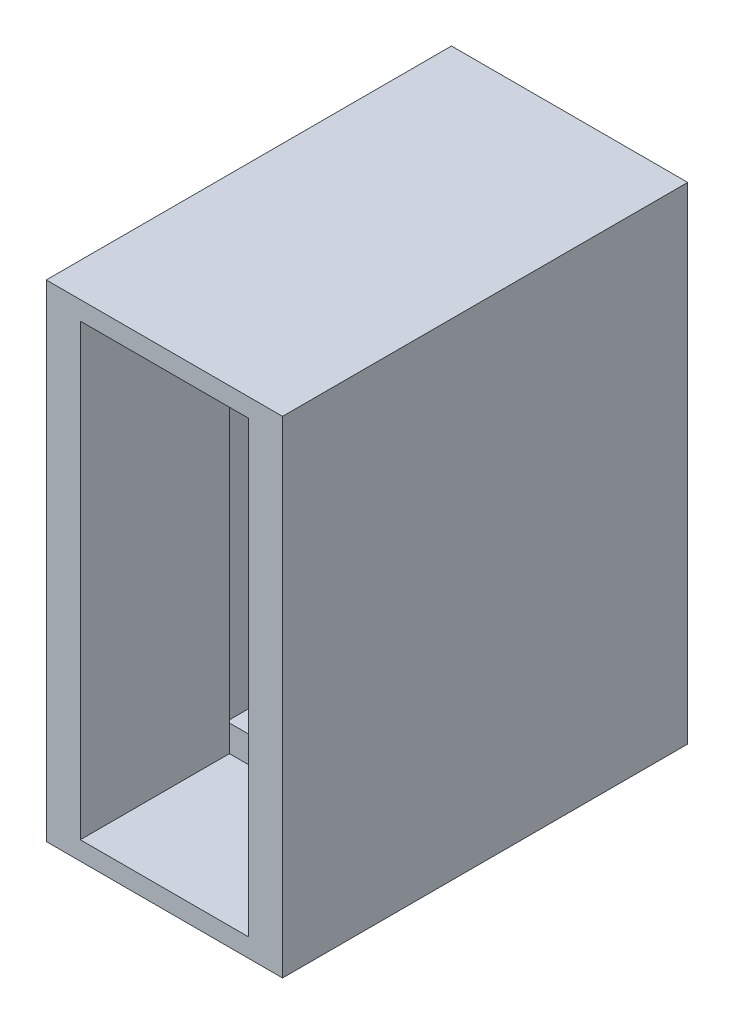
ISO-10303-21;
HEADER;
FILE_DESCRIPTION(('STEP AP214'),'2;1');
FILE_NAME('part.step','',(''),(''),'','','');
FILE_SCHEMA(('AUTOMOTIVE_DESIGN { 1 0 10303 214 1 1 1 1 }'));
ENDSEC;
DATA;
#1=APPLICATION_CONTEXT('core data for automotive mechanical design processes');
#2=APPLICATION_PROTOCOL_DEFINITION('international standard','automotive_design',2000,#1);
#3=PRODUCT_CONTEXT('',#1,'mechanical');
#4=PRODUCT('Part','Part','',(#3));
#5=PRODUCT_RELATED_PRODUCT_CATEGORY('part','',(#4));
#6=PRODUCT_DEFINITION_FORMATION('','',#4);
#7=PRODUCT_DEFINITION_CONTEXT('part definition',#1,'design');
#8=PRODUCT_DEFINITION('design','',#6,#7);
#9=PRODUCT_DEFINITION_SHAPE('','',#8);
#10=(LENGTH_UNIT() NAMED_UNIT(*) SI_UNIT(.MILLI.,.METRE.));
#11=(NAMED_UNIT(*) PLANE_ANGLE_UNIT() SI_UNIT($,.RADIAN.));
#12=(NAMED_UNIT(*) SI_UNIT($,.STERADIAN.) SOLID_ANGLE_UNIT());
#13=UNCERTAINTY_MEASURE_WITH_UNIT(LENGTH_MEASURE(1.E-05),#10,'distance_accuracy_value','');
#14=(GEOMETRIC_REPRESENTATION_CONTEXT(3) GLOBAL_UNCERTAINTY_ASSIGNED_CONTEXT((#13)) GLOBAL_UNIT_ASSIGNED_CONTEXT((#10,
#11,#12)) REPRESENTATION_CONTEXT('',''));
#15=CARTESIAN_POINT('',(0.,0.,0.));
#16=DIRECTION('',(0.,0.,1.));
#17=DIRECTION('',(1.,0.,0.));
#18=AXIS2_PLACEMENT_3D('',#15,#16,#17);
#19=CARTESIAN_POINT('',(0.,0.,29.27));
#20=DIRECTION('',(0.,0.,1.));
#21=DIRECTION('',(1.,0.,0.));
#22=AXIS2_PLACEMENT_3D('',#19,#20,#21);
#23=PLANE('',#22);
#24=DIRECTION('',(1.,0.,0.));
#25=VECTOR('',#24,1.);
#26=CARTESIAN_POINT('',(-2.24999999999999,3.25,29.27));
#27=LINE('',#26,#25);
#28=CARTESIAN_POINT('',(-14.55,3.25,29.27));
#29=VERTEX_POINT('',#28);
#30=CARTESIAN_POINT('',(-2.45,3.25,29.27));
#31=VERTEX_POINT('',#30);
#32=EDGE_CURVE('E11',#29,#31,#27,.T.);
#33=ORIENTED_EDGE('',*,*,#32,.F.);
#34=DIRECTION('',(0.,-1.,0.));
#35=VECTOR('',#34,1.);
#36=CARTESIAN_POINT('',(-14.55,1.34,29.27));
#37=LINE('',#36,#35);
#38=CARTESIAN_POINT('',(-14.55,1.34,29.27));
#39=VERTEX_POINT('',#38);
#40=EDGE_CURVE('E241',#29,#39,#37,.T.);
#41=ORIENTED_EDGE('',*,*,#40,.T.);
#42=DIRECTION('',(1.,0.,0.));
#43=VECTOR('',#42,1.);
#44=CARTESIAN_POINT('',(-2.45,1.34,29.27));
#45=LINE('',#44,#43);
#46=CARTESIAN_POINT('',(-2.45,1.34,29.27));
#47=VERTEX_POINT('',#46);
#48=EDGE_CURVE('E263',#39,#47,#45,.T.);
#49=ORIENTED_EDGE('',*,*,#48,.T.);
#50=DIRECTION('',(0.,1.,0.));
#51=VECTOR('',#50,1.);
#52=CARTESIAN_POINT('',(-2.45,1.34,29.27));
#53=LINE('',#52,#51);
#54=EDGE_CURVE('E257',#47,#31,#53,.T.);
#55=ORIENTED_EDGE('',*,*,#54,.T.);
#56=EDGE_LOOP('',(#33,#41,#49,#55));
#57=FACE_BOUND('',#56,.T.);
#58=ADVANCED_FACE('F44',(#57),#23,.T.);
#59=CARTESIAN_POINT('',(0.,0.,40.));
#60=DIRECTION('',(-1.,0.,0.));
#61=DIRECTION('',(0.,0.,1.));
#62=AXIS2_PLACEMENT_3D('',#59,#60,#61);
#63=PLANE('',#62);
#64=DIRECTION('',(0.,0.,-1.));
#65=VECTOR('',#64,1.);
#66=CARTESIAN_POINT('',(0.,0.,40.));
#67=LINE('',#66,#65);
#68=CARTESIAN_POINT('',(0.,0.,40.));
#69=VERTEX_POINT('',#68);
#70=CARTESIAN_POINT('',(0.,0.,10.843475328993));
#71=VERTEX_POINT('',#70);
#72=EDGE_CURVE('E189',#69,#71,#67,.T.);
#73=ORIENTED_EDGE('',*,*,#72,.T.);
#74=DIRECTION('',(0.,1.,0.));
#75=VECTOR('',#74,1.);
#76=CARTESIAN_POINT('',(0.,35.,10.843475328993));
#77=LINE('',#76,#75);
#78=CARTESIAN_POINT('',(0.,35.,10.843475328993));
#79=VERTEX_POINT('',#78);
#80=EDGE_CURVE('E64',#71,#79,#77,.T.);
#81=ORIENTED_EDGE('',*,*,#80,.T.);
#82=DIRECTION('',(0.,0.,-1.));
#83=VECTOR('',#82,1.);
#84=CARTESIAN_POINT('',(0.,35.,40.));
#85=LINE('',#84,#83);
#86=CARTESIAN_POINT('',(0.,35.,40.));
#87=VERTEX_POINT('',#86);
#88=EDGE_CURVE('E48',#87,#79,#85,.T.);
#89=ORIENTED_EDGE('',*,*,#88,.F.);
#90=DIRECTION('',(0.,1.,0.));
#91=VECTOR('',#90,1.);
#92=CARTESIAN_POINT('',(0.,0.,40.));
#93=LINE('',#92,#91);
#94=EDGE_CURVE('E220',#69,#87,#93,.T.);
#95=ORIENTED_EDGE('',*,*,#94,.F.);
#96=EDGE_LOOP('',(#73,#81,#89,#95));
#97=FACE_BOUND('',#96,.T.);
#98=ADVANCED_FACE('F46',(#97),#63,.F.);
#99=CARTESIAN_POINT('',(0.,35.,40.));
#100=DIRECTION('',(0.,-1.,0.));
#101=DIRECTION('',(1.,0.,0.));
#102=AXIS2_PLACEMENT_3D('',#99,#100,#101);
#103=PLANE('',#102);
#104=ORIENTED_EDGE('',*,*,#88,.T.);
#105=DIRECTION('',(-1.,0.,0.));
#106=VECTOR('',#105,1.);
#107=CARTESIAN_POINT('',(0.,35.,10.843475328993));
#108=LINE('',#107,#106);
#109=CARTESIAN_POINT('',(-17.,35.,10.843475328993));
#110=VERTEX_POINT('',#109);
#111=EDGE_CURVE('E172',#79,#110,#108,.T.);
#112=ORIENTED_EDGE('',*,*,#111,.T.);
#113=DIRECTION('',(0.,0.,-1.));
#114=VECTOR('',#113,1.);
#115=CARTESIAN_POINT('',(-17.,35.,40.));
#116=LINE('',#115,#114);
#117=CARTESIAN_POINT('',(-17.,35.,40.));
#118=VERTEX_POINT('',#117);
#119=EDGE_CURVE('E196',#118,#110,#116,.T.);
#120=ORIENTED_EDGE('',*,*,#119,.F.);
#121=DIRECTION('',(-1.,0.,0.));
#122=VECTOR('',#121,1.);
#123=CARTESIAN_POINT('',(0.,35.,40.));
#124=LINE('',#123,#122);
#125=EDGE_CURVE('E193',#87,#118,#124,.T.);
#126=ORIENTED_EDGE('',*,*,#125,.F.);
#127=EDGE_LOOP('',(#104,#112,#120,#126));
#128=FACE_BOUND('',#127,.T.);
#129=ADVANCED_FACE('F192',(#128),#103,.F.);
#130=CARTESIAN_POINT('',(-17.,0.,40.));
#131=DIRECTION('',(1.,0.,0.));
#132=DIRECTION('',(0.,1.,0.));
#133=AXIS2_PLACEMENT_3D('',#130,#131,#132);
#134=PLANE('',#133);
#135=ORIENTED_EDGE('',*,*,#119,.T.);
#136=DIRECTION('',(0.,1.,0.));
#137=VECTOR('',#136,1.);
#138=CARTESIAN_POINT('',(-17.,35.,10.843475328993));
#139=LINE('',#138,#137);
#140=CARTESIAN_POINT('',(-17.,0.,10.843475328993));
#141=VERTEX_POINT('',#140);
#142=EDGE_CURVE('E175',#141,#110,#139,.T.);
#143=ORIENTED_EDGE('',*,*,#142,.F.);
#144=DIRECTION('',(0.,0.,-1.));
#145=VECTOR('',#144,1.);
#146=CARTESIAN_POINT('',(-17.,0.,40.));
#147=LINE('',#146,#145);
#148=CARTESIAN_POINT('',(-17.,0.,40.));
#149=VERTEX_POINT('',#148);
#150=EDGE_CURVE('E203',#149,#141,#147,.T.);
#151=ORIENTED_EDGE('',*,*,#150,.F.);
#152=DIRECTION('',(0.,-1.,0.));
#153=VECTOR('',#152,1.);
#154=CARTESIAN_POINT('',(-17.,0.,40.));
#155=LINE('',#154,#153);
#156=EDGE_CURVE('E215',#118,#149,#155,.T.);
#157=ORIENTED_EDGE('',*,*,#156,.F.);
#158=EDGE_LOOP('',(#135,#143,#151,#157));
#159=FACE_BOUND('',#158,.T.);
#160=ADVANCED_FACE('F411',(#159),#134,.F.);
#161=CARTESIAN_POINT('',(0.,0.,40.));
#162=DIRECTION('',(0.,1.,0.));
#163=DIRECTION('',(-1.,0.,0.));
#164=AXIS2_PLACEMENT_3D('',#161,#162,#163);
#165=PLANE('',#164);
#166=DIRECTION('',(-1.,0.,0.));
#167=VECTOR('',#166,1.);
#168=CARTESIAN_POINT('',(0.,0.,13.7947712649507));
#169=LINE('',#168,#167);
#170=CARTESIAN_POINT('',(-3.99999999999999,0.,13.7947712649507));
#171=VERTEX_POINT('',#170);
#172=CARTESIAN_POINT('',(-13.,0.,13.7947712649507));
#173=VERTEX_POINT('',#172);
#174=EDGE_CURVE('E316',#171,#173,#169,.T.);
#175=ORIENTED_EDGE('',*,*,#174,.T.);
#176=DIRECTION('',(0.,0.,1.));
#177=VECTOR('',#176,1.);
#178=CARTESIAN_POINT('',(-13.,0.,40.));
#179=LINE('',#178,#177);
#180=CARTESIAN_POINT('',(-13.,0.,20.2947712649507));
#181=VERTEX_POINT('',#180);
#182=EDGE_CURVE('E298',#173,#181,#179,.T.);
#183=ORIENTED_EDGE('',*,*,#182,.T.);
#184=DIRECTION('',(1.,0.,0.));
#185=VECTOR('',#184,1.);
#186=CARTESIAN_POINT('',(0.,0.,20.2947712649507));
#187=LINE('',#186,#185);
#188=CARTESIAN_POINT('',(-3.99999999999999,0.,20.2947712649507));
#189=VERTEX_POINT('',#188);
#190=EDGE_CURVE('E324',#181,#189,#187,.T.);
#191=ORIENTED_EDGE('',*,*,#190,.T.);
#192=DIRECTION('',(0.,0.,-1.));
#193=VECTOR('',#192,1.);
#194=CARTESIAN_POINT('',(-3.99999999999999,0.,40.));
#195=LINE('',#194,#193);
#196=EDGE_CURVE('E320',#189,#171,#195,.T.);
#197=ORIENTED_EDGE('',*,*,#196,.T.);
#198=EDGE_LOOP('',(#175,#183,#191,#197));
#199=FACE_BOUND('',#198,.T.);
#200=ORIENTED_EDGE('',*,*,#150,.T.);
#201=DIRECTION('',(-1.,0.,0.));
#202=VECTOR('',#201,1.);
#203=CARTESIAN_POINT('',(0.,0.,10.843475328993));
#204=LINE('',#203,#202);
#205=EDGE_CURVE('E182',#71,#141,#204,.T.);
#206=ORIENTED_EDGE('',*,*,#205,.F.);
#207=ORIENTED_EDGE('',*,*,#72,.F.);
#208=DIRECTION('',(1.,0.,0.));
#209=VECTOR('',#208,1.);
#210=CARTESIAN_POINT('',(0.,0.,40.));
#211=LINE('',#210,#209);
#212=EDGE_CURVE('E212',#149,#69,#211,.T.);
#213=ORIENTED_EDGE('',*,*,#212,.F.);
#214=EDGE_LOOP('',(#200,#206,#207,#213));
#215=FACE_BOUND('',#214,.T.);
#216=ADVANCED_FACE('F406',(#199,#215),#165,.F.);
#217=CARTESIAN_POINT('',(0.,0.,40.));
#218=DIRECTION('',(0.,0.,1.));
#219=DIRECTION('',(1.,0.,0.));
#220=AXIS2_PLACEMENT_3D('',#217,#218,#219);
#221=PLANE('',#220);
#222=DIRECTION('',(0.,-1.,0.));
#223=VECTOR('',#222,1.);
#224=CARTESIAN_POINT('',(-14.55,1.34,40.));
#225=LINE('',#224,#223);
#226=CARTESIAN_POINT('',(-14.55,33.66,40.));
#227=VERTEX_POINT('',#226);
#228=CARTESIAN_POINT('',(-14.55,1.34,40.));
#229=VERTEX_POINT('',#228);
#230=EDGE_CURVE('E250',#227,#229,#225,.T.);
#231=ORIENTED_EDGE('',*,*,#230,.F.);
#232=DIRECTION('',(-1.,0.,0.));
#233=VECTOR('',#232,1.);
#234=CARTESIAN_POINT('',(-2.45,33.66,40.));
#235=LINE('',#234,#233);
#236=CARTESIAN_POINT('',(-2.45,33.66,40.));
#237=VERTEX_POINT('',#236);
#238=EDGE_CURVE('E237',#237,#227,#235,.T.);
#239=ORIENTED_EDGE('',*,*,#238,.F.);
#240=DIRECTION('',(0.,1.,0.));
#241=VECTOR('',#240,1.);
#242=CARTESIAN_POINT('',(-2.45,1.34,40.));
#243=LINE('',#242,#241);
#244=CARTESIAN_POINT('',(-2.45,1.34,40.));
#245=VERTEX_POINT('',#244);
#246=EDGE_CURVE('E242',#245,#237,#243,.T.);
#247=ORIENTED_EDGE('',*,*,#246,.F.);
#248=DIRECTION('',(1.,0.,0.));
#249=VECTOR('',#248,1.);
#250=CARTESIAN_POINT('',(-2.45,1.34,40.));
#251=LINE('',#250,#249);
#252=EDGE_CURVE('E246',#229,#245,#251,.T.);
#253=ORIENTED_EDGE('',*,*,#252,.F.);
#254=EDGE_LOOP('',(#231,#239,#247,#253));
#255=FACE_BOUND('',#254,.T.);
#256=ORIENTED_EDGE('',*,*,#94,.T.);
#257=ORIENTED_EDGE('',*,*,#125,.T.);
#258=ORIENTED_EDGE('',*,*,#156,.T.);
#259=ORIENTED_EDGE('',*,*,#212,.T.);
#260=EDGE_LOOP('',(#256,#257,#258,#259));
#261=FACE_BOUND('',#260,.T.);
#262=ADVANCED_FACE('F403',(#255,#261),#221,.T.);
#263=CARTESIAN_POINT('',(-14.55,1.34,29.27));
#264=DIRECTION('',(-1.,0.,0.));
#265=DIRECTION('',(0.,-1.,0.));
#266=AXIS2_PLACEMENT_3D('',#263,#264,#265);
#267=PLANE('',#266);
#268=ORIENTED_EDGE('',*,*,#230,.T.);
#269=DIRECTION('',(0.,0.,1.));
#270=VECTOR('',#269,1.);
#271=CARTESIAN_POINT('',(-14.55,1.34,29.27));
#272=LINE('',#271,#270);
#273=EDGE_CURVE('E224',#39,#229,#272,.T.);
#274=ORIENTED_EDGE('',*,*,#273,.F.);
#275=ORIENTED_EDGE('',*,*,#40,.F.);
#276=CARTESIAN_POINT('',(-14.55,31.75,29.27));
#277=VERTEX_POINT('',#276);
#278=EDGE_CURVE('E271',#277,#29,#37,.T.);
#279=ORIENTED_EDGE('',*,*,#278,.F.);
#280=CARTESIAN_POINT('',(-14.55,33.66,29.27));
#281=VERTEX_POINT('',#280);
#282=EDGE_CURVE('E267',#281,#277,#37,.T.);
#283=ORIENTED_EDGE('',*,*,#282,.F.);
#284=DIRECTION('',(0.,0.,1.));
#285=VECTOR('',#284,1.);
#286=CARTESIAN_POINT('',(-14.55,33.66,29.27));
#287=LINE('',#286,#285);
#288=EDGE_CURVE('E223',#281,#227,#287,.T.);
#289=ORIENTED_EDGE('',*,*,#288,.T.);
#290=EDGE_LOOP('',(#268,#274,#275,#279,#283,#289));
#291=FACE_BOUND('',#290,.T.);
#292=ADVANCED_FACE('F386',(#291),#267,.F.);
#293=CARTESIAN_POINT('',(-2.45,33.66,29.27));
#294=DIRECTION('',(0.,1.,0.));
#295=DIRECTION('',(0.,0.,1.));
#296=AXIS2_PLACEMENT_3D('',#293,#294,#295);
#297=PLANE('',#296);
#298=ORIENTED_EDGE('',*,*,#238,.T.);
#299=ORIENTED_EDGE('',*,*,#288,.F.);
#300=DIRECTION('',(-1.,0.,0.));
#301=VECTOR('',#300,1.);
#302=CARTESIAN_POINT('',(-2.45,33.66,29.27));
#303=LINE('',#302,#301);
#304=CARTESIAN_POINT('',(-2.45,33.66,29.27));
#305=VERTEX_POINT('',#304);
#306=EDGE_CURVE('E229',#305,#281,#303,.T.);
#307=ORIENTED_EDGE('',*,*,#306,.F.);
#308=DIRECTION('',(0.,0.,1.));
#309=VECTOR('',#308,1.);
#310=CARTESIAN_POINT('',(-2.45,33.66,29.27));
#311=LINE('',#310,#309);
#312=EDGE_CURVE('E232',#305,#237,#311,.T.);
#313=ORIENTED_EDGE('',*,*,#312,.T.);
#314=EDGE_LOOP('',(#298,#299,#307,#313));
#315=FACE_BOUND('',#314,.T.);
#316=ADVANCED_FACE('F383',(#315),#297,.F.);
#317=CARTESIAN_POINT('',(-2.45,1.34,29.27));
#318=DIRECTION('',(1.,0.,0.));
#319=DIRECTION('',(0.,1.,0.));
#320=AXIS2_PLACEMENT_3D('',#317,#318,#319);
#321=PLANE('',#320);
#322=ORIENTED_EDGE('',*,*,#246,.T.);
#323=ORIENTED_EDGE('',*,*,#312,.F.);
#324=CARTESIAN_POINT('',(-2.45,31.75,29.27));
#325=VERTEX_POINT('',#324);
#326=EDGE_CURVE('E262',#325,#305,#53,.T.);
#327=ORIENTED_EDGE('',*,*,#326,.F.);
#328=EDGE_CURVE('E261',#31,#325,#53,.T.);
#329=ORIENTED_EDGE('',*,*,#328,.F.);
#330=ORIENTED_EDGE('',*,*,#54,.F.);
#331=DIRECTION('',(0.,0.,1.));
#332=VECTOR('',#331,1.);
#333=CARTESIAN_POINT('',(-2.45,1.34,29.27));
#334=LINE('',#333,#332);
#335=EDGE_CURVE('E228',#47,#245,#334,.T.);
#336=ORIENTED_EDGE('',*,*,#335,.T.);
#337=EDGE_LOOP('',(#322,#323,#327,#329,#330,#336));
#338=FACE_BOUND('',#337,.T.);
#339=ADVANCED_FACE('F378',(#338),#321,.F.);
#340=CARTESIAN_POINT('',(-2.45,1.34,29.27));
#341=DIRECTION('',(0.,-1.,0.));
#342=DIRECTION('',(1.,0.,0.));
#343=AXIS2_PLACEMENT_3D('',#340,#341,#342);
#344=PLANE('',#343);
#345=ORIENTED_EDGE('',*,*,#252,.T.);
#346=ORIENTED_EDGE('',*,*,#335,.F.);
#347=ORIENTED_EDGE('',*,*,#48,.F.);
#348=ORIENTED_EDGE('',*,*,#273,.T.);
#349=EDGE_LOOP('',(#345,#346,#347,#348));
#350=FACE_BOUND('',#349,.T.);
#351=ADVANCED_FACE('F401',(#350),#344,.F.);
#352=DIRECTION('',(-1.,0.,0.));
#353=VECTOR('',#352,1.);
#354=CARTESIAN_POINT('',(-2.25,31.75,29.27));
#355=LINE('',#354,#353);
#356=EDGE_CURVE('E54',#325,#277,#355,.T.);
#357=ORIENTED_EDGE('',*,*,#356,.F.);
#358=ORIENTED_EDGE('',*,*,#326,.T.);
#359=ORIENTED_EDGE('',*,*,#306,.T.);
#360=ORIENTED_EDGE('',*,*,#282,.T.);
#361=EDGE_LOOP('',(#357,#358,#359,#360));
#362=FACE_BOUND('',#361,.T.);
#363=ADVANCED_FACE('F373',(#362),#23,.T.);
#364=CARTESIAN_POINT('',(0.,0.,29.27));
#365=DIRECTION('',(0.,0.,1.));
#366=DIRECTION('',(1.,0.,0.));
#367=AXIS2_PLACEMENT_3D('',#364,#365,#366);
#368=PLANE('',#367);
#369=ORIENTED_EDGE('',*,*,#278,.T.);
#370=CARTESIAN_POINT('',(-14.75,3.25,29.27));
#371=VERTEX_POINT('',#370);
#372=EDGE_CURVE('E56',#371,#29,#27,.T.);
#373=ORIENTED_EDGE('',*,*,#372,.F.);
#374=DIRECTION('',(0.,-1.,0.));
#375=VECTOR('',#374,1.);
#376=CARTESIAN_POINT('',(-14.75,3.25,29.27));
#377=LINE('',#376,#375);
#378=CARTESIAN_POINT('',(-14.75,31.75,29.27));
#379=VERTEX_POINT('',#378);
#380=EDGE_CURVE('E294',#379,#371,#377,.T.);
#381=ORIENTED_EDGE('',*,*,#380,.F.);
#382=EDGE_CURVE('E202',#277,#379,#355,.T.);
#383=ORIENTED_EDGE('',*,*,#382,.F.);
#384=EDGE_LOOP('',(#369,#373,#381,#383));
#385=FACE_BOUND('',#384,.T.);
#386=ADVANCED_FACE('F391',(#385),#368,.F.);
#387=CARTESIAN_POINT('',(-14.75,3.25,12.27));
#388=DIRECTION('',(-1.,0.,0.));
#389=DIRECTION('',(0.,-1.,0.));
#390=AXIS2_PLACEMENT_3D('',#387,#388,#389);
#391=PLANE('',#390);
#392=ORIENTED_EDGE('',*,*,#380,.T.);
#393=DIRECTION('',(0.,0.,1.));
#394=VECTOR('',#393,1.);
#395=CARTESIAN_POINT('',(-14.75,3.25,12.27));
#396=LINE('',#395,#394);
#397=CARTESIAN_POINT('',(-14.75,3.25,12.27));
#398=VERTEX_POINT('',#397);
#399=EDGE_CURVE('E272',#398,#371,#396,.T.);
#400=ORIENTED_EDGE('',*,*,#399,.F.);
#401=DIRECTION('',(0.,-1.,0.));
#402=VECTOR('',#401,1.);
#403=CARTESIAN_POINT('',(-14.75,3.25,12.27));
#404=LINE('',#403,#402);
#405=CARTESIAN_POINT('',(-14.75,31.75,12.27));
#406=VERTEX_POINT('',#405);
#407=EDGE_CURVE('E287',#406,#398,#404,.T.);
#408=ORIENTED_EDGE('',*,*,#407,.F.);
#409=DIRECTION('',(0.,0.,1.));
#410=VECTOR('',#409,1.);
#411=CARTESIAN_POINT('',(-14.75,31.75,12.27));
#412=LINE('',#411,#410);
#413=EDGE_CURVE('E253',#406,#379,#412,.T.);
#414=ORIENTED_EDGE('',*,*,#413,.T.);
#415=EDGE_LOOP('',(#392,#400,#408,#414));
#416=FACE_BOUND('',#415,.T.);
#417=ADVANCED_FACE('F434',(#416),#391,.F.);
#418=CARTESIAN_POINT('',(-2.25,31.75,12.27));
#419=DIRECTION('',(0.,1.,0.));
#420=DIRECTION('',(-1.,0.,0.));
#421=AXIS2_PLACEMENT_3D('',#418,#419,#420);
#422=PLANE('',#421);
#423=CARTESIAN_POINT('',(-2.25,31.75,29.27));
#424=VERTEX_POINT('',#423);
#425=EDGE_CURVE('E201',#424,#325,#355,.T.);
#426=ORIENTED_EDGE('',*,*,#425,.T.);
#427=ORIENTED_EDGE('',*,*,#356,.T.);
#428=ORIENTED_EDGE('',*,*,#382,.T.);
#429=ORIENTED_EDGE('',*,*,#413,.F.);
#430=DIRECTION('',(-1.,0.,0.));
#431=VECTOR('',#430,1.);
#432=CARTESIAN_POINT('',(-2.25,31.75,12.27));
#433=LINE('',#432,#431);
#434=CARTESIAN_POINT('',(-2.25,31.75,12.27));
#435=VERTEX_POINT('',#434);
#436=EDGE_CURVE('E276',#435,#406,#433,.T.);
#437=ORIENTED_EDGE('',*,*,#436,.F.);
#438=DIRECTION('',(0.,0.,1.));
#439=VECTOR('',#438,1.);
#440=CARTESIAN_POINT('',(-2.25,31.75,12.27));
#441=LINE('',#440,#439);
#442=EDGE_CURVE('E280',#435,#424,#441,.T.);
#443=ORIENTED_EDGE('',*,*,#442,.T.);
#444=EDGE_LOOP('',(#426,#427,#428,#429,#437,#443));
#445=FACE_BOUND('',#444,.T.);
#446=ADVANCED_FACE('F491',(#445),#422,.F.);
#447=CARTESIAN_POINT('',(-2.24999999999999,3.25,12.27));
#448=DIRECTION('',(1.,0.,0.));
#449=DIRECTION('',(0.,1.,0.));
#450=AXIS2_PLACEMENT_3D('',#447,#448,#449);
#451=PLANE('',#450);
#452=DIRECTION('',(0.,1.,0.));
#453=VECTOR('',#452,1.);
#454=CARTESIAN_POINT('',(-2.24999999999999,3.25,29.27));
#455=LINE('',#454,#453);
#456=CARTESIAN_POINT('',(-2.24999999999999,3.25,29.27));
#457=VERTEX_POINT('',#456);
#458=EDGE_CURVE('E288',#457,#424,#455,.T.);
#459=ORIENTED_EDGE('',*,*,#458,.T.);
#460=ORIENTED_EDGE('',*,*,#442,.F.);
#461=DIRECTION('',(0.,1.,0.));
#462=VECTOR('',#461,1.);
#463=CARTESIAN_POINT('',(-2.24999999999999,3.25,12.27));
#464=LINE('',#463,#462);
#465=CARTESIAN_POINT('',(-2.24999999999999,3.25,12.27));
#466=VERTEX_POINT('',#465);
#467=EDGE_CURVE('E302',#466,#435,#464,.T.);
#468=ORIENTED_EDGE('',*,*,#467,.F.);
#469=DIRECTION('',(0.,0.,1.));
#470=VECTOR('',#469,1.);
#471=CARTESIAN_POINT('',(-2.24999999999999,3.25,12.27));
#472=LINE('',#471,#470);
#473=EDGE_CURVE('E275',#466,#457,#472,.T.);
#474=ORIENTED_EDGE('',*,*,#473,.T.);
#475=EDGE_LOOP('',(#459,#460,#468,#474));
#476=FACE_BOUND('',#475,.T.);
#477=ADVANCED_FACE('F499',(#476),#451,.F.);
#478=CARTESIAN_POINT('',(-2.24999999999999,3.25,12.27));
#479=DIRECTION('',(0.,-1.,0.));
#480=DIRECTION('',(1.,0.,0.));
#481=AXIS2_PLACEMENT_3D('',#478,#479,#480);
#482=PLANE('',#481);
#483=DIRECTION('',(1.,0.,0.));
#484=VECTOR('',#483,1.);
#485=CARTESIAN_POINT('',(-13.,3.25,20.2947712649507));
#486=LINE('',#485,#484);
#487=CARTESIAN_POINT('',(-13.,3.25,20.2947712649507));
#488=VERTEX_POINT('',#487);
#489=CARTESIAN_POINT('',(-3.99999999999999,3.25,20.2947712649507));
#490=VERTEX_POINT('',#489);
#491=EDGE_CURVE('E348',#488,#490,#486,.T.);
#492=ORIENTED_EDGE('',*,*,#491,.F.);
#493=DIRECTION('',(0.,0.,1.));
#494=VECTOR('',#493,1.);
#495=CARTESIAN_POINT('',(-13.,3.25,13.7947712649507));
#496=LINE('',#495,#494);
#497=CARTESIAN_POINT('',(-13.,3.25,13.7947712649507));
#498=VERTEX_POINT('',#497);
#499=EDGE_CURVE('E181',#498,#488,#496,.T.);
#500=ORIENTED_EDGE('',*,*,#499,.F.);
#501=DIRECTION('',(-1.,0.,0.));
#502=VECTOR('',#501,1.);
#503=CARTESIAN_POINT('',(-13.,3.25,13.7947712649507));
#504=LINE('',#503,#502);
#505=CARTESIAN_POINT('',(-3.99999999999999,3.25,13.7947712649507));
#506=VERTEX_POINT('',#505);
#507=EDGE_CURVE('E333',#506,#498,#504,.T.);
#508=ORIENTED_EDGE('',*,*,#507,.F.);
#509=DIRECTION('',(0.,0.,-1.));
#510=VECTOR('',#509,1.);
#511=CARTESIAN_POINT('',(-3.99999999999999,3.25,13.7947712649507));
#512=LINE('',#511,#510);
#513=EDGE_CURVE('E344',#490,#506,#512,.T.);
#514=ORIENTED_EDGE('',*,*,#513,.F.);
#515=EDGE_LOOP('',(#492,#500,#508,#514));
#516=FACE_BOUND('',#515,.T.);
#517=ORIENTED_EDGE('',*,*,#372,.T.);
#518=ORIENTED_EDGE('',*,*,#32,.T.);
#519=EDGE_CURVE('E57',#31,#457,#27,.T.);
#520=ORIENTED_EDGE('',*,*,#519,.T.);
#521=ORIENTED_EDGE('',*,*,#473,.F.);
#522=DIRECTION('',(1.,0.,0.));
#523=VECTOR('',#522,1.);
#524=CARTESIAN_POINT('',(-2.24999999999999,3.25,12.27));
#525=LINE('',#524,#523);
#526=EDGE_CURVE('E306',#398,#466,#525,.T.);
#527=ORIENTED_EDGE('',*,*,#526,.F.);
#528=ORIENTED_EDGE('',*,*,#399,.T.);
#529=EDGE_LOOP('',(#517,#518,#520,#521,#527,#528));
#530=FACE_BOUND('',#529,.T.);
#531=ADVANCED_FACE('F395',(#516,#530),#482,.F.);
#532=CARTESIAN_POINT('',(0.,0.,12.27));
#533=DIRECTION('',(0.,0.,1.));
#534=DIRECTION('',(1.,0.,0.));
#535=AXIS2_PLACEMENT_3D('',#532,#533,#534);
#536=PLANE('',#535);
#537=ORIENTED_EDGE('',*,*,#407,.T.);
#538=ORIENTED_EDGE('',*,*,#526,.T.);
#539=ORIENTED_EDGE('',*,*,#467,.T.);
#540=ORIENTED_EDGE('',*,*,#436,.T.);
#541=EDGE_LOOP('',(#537,#538,#539,#540));
#542=FACE_BOUND('',#541,.T.);
#543=ADVANCED_FACE('F515',(#542),#536,.T.);
#544=ORIENTED_EDGE('',*,*,#328,.T.);
#545=ORIENTED_EDGE('',*,*,#425,.F.);
#546=ORIENTED_EDGE('',*,*,#458,.F.);
#547=ORIENTED_EDGE('',*,*,#519,.F.);
#548=EDGE_LOOP('',(#544,#545,#546,#547));
#549=FACE_BOUND('',#548,.T.);
#550=ADVANCED_FACE('F367',(#549),#368,.F.);
#551=CARTESIAN_POINT('',(-13.,-13.75,13.7947712649507));
#552=DIRECTION('',(-1.,0.,0.));
#553=DIRECTION('',(0.,0.,1.));
#554=AXIS2_PLACEMENT_3D('',#551,#552,#553);
#555=PLANE('',#554);
#556=DIRECTION('',(0.,1.,0.));
#557=VECTOR('',#556,1.);
#558=CARTESIAN_POINT('',(-13.,-13.75,13.7947712649507));
#559=LINE('',#558,#557);
#560=EDGE_CURVE('E328',#173,#498,#559,.T.);
#561=ORIENTED_EDGE('',*,*,#560,.T.);
#562=ORIENTED_EDGE('',*,*,#499,.T.);
#563=DIRECTION('',(0.,1.,0.));
#564=VECTOR('',#563,1.);
#565=CARTESIAN_POINT('',(-13.,-13.75,20.2947712649507));
#566=LINE('',#565,#564);
#567=EDGE_CURVE('E329',#181,#488,#566,.T.);
#568=ORIENTED_EDGE('',*,*,#567,.F.);
#569=ORIENTED_EDGE('',*,*,#182,.F.);
#570=EDGE_LOOP('',(#561,#562,#568,#569));
#571=FACE_BOUND('',#570,.T.);
#572=ADVANCED_FACE('F532',(#571),#555,.F.);
#573=CARTESIAN_POINT('',(-13.,-13.75,13.7947712649507));
#574=DIRECTION('',(0.,0.,-1.));
#575=DIRECTION('',(-1.,0.,0.));
#576=AXIS2_PLACEMENT_3D('',#573,#574,#575);
#577=PLANE('',#576);
#578=DIRECTION('',(0.,1.,0.));
#579=VECTOR('',#578,1.);
#580=CARTESIAN_POINT('',(-3.99999999999999,-13.75,13.7947712649507));
#581=LINE('',#580,#579);
#582=EDGE_CURVE('E336',#171,#506,#581,.T.);
#583=ORIENTED_EDGE('',*,*,#582,.T.);
#584=ORIENTED_EDGE('',*,*,#507,.T.);
#585=ORIENTED_EDGE('',*,*,#560,.F.);
#586=ORIENTED_EDGE('',*,*,#174,.F.);
#587=EDGE_LOOP('',(#583,#584,#585,#586));
#588=FACE_BOUND('',#587,.T.);
#589=ADVANCED_FACE('F539',(#588),#577,.F.);
#590=CARTESIAN_POINT('',(-3.99999999999999,-13.75,13.7947712649507));
#591=DIRECTION('',(1.,0.,0.));
#592=DIRECTION('',(0.,1.,0.));
#593=AXIS2_PLACEMENT_3D('',#590,#591,#592);
#594=PLANE('',#593);
#595=DIRECTION('',(0.,1.,0.));
#596=VECTOR('',#595,1.);
#597=CARTESIAN_POINT('',(-3.99999999999999,-13.75,20.2947712649507));
#598=LINE('',#597,#596);
#599=EDGE_CURVE('E72',#189,#490,#598,.T.);
#600=ORIENTED_EDGE('',*,*,#599,.T.);
#601=ORIENTED_EDGE('',*,*,#513,.T.);
#602=ORIENTED_EDGE('',*,*,#582,.F.);
#603=ORIENTED_EDGE('',*,*,#196,.F.);
#604=EDGE_LOOP('',(#600,#601,#602,#603));
#605=FACE_BOUND('',#604,.T.);
#606=ADVANCED_FACE('F548',(#605),#594,.F.);
#607=CARTESIAN_POINT('',(-13.,-13.75,20.2947712649507));
#608=DIRECTION('',(0.,0.,1.));
#609=DIRECTION('',(1.,0.,0.));
#610=AXIS2_PLACEMENT_3D('',#607,#608,#609);
#611=PLANE('',#610);
#612=ORIENTED_EDGE('',*,*,#567,.T.);
#613=ORIENTED_EDGE('',*,*,#491,.T.);
#614=ORIENTED_EDGE('',*,*,#599,.F.);
#615=ORIENTED_EDGE('',*,*,#190,.F.);
#616=EDGE_LOOP('',(#612,#613,#614,#615));
#617=FACE_BOUND('',#616,.T.);
#618=ADVANCED_FACE('F557',(#617),#611,.F.);
#619=CARTESIAN_POINT('',(0.,35.,10.843475328993));
#620=DIRECTION('',(0.,0.,1.));
#621=DIRECTION('',(1.,0.,0.));
#622=AXIS2_PLACEMENT_3D('',#619,#620,#621);
#623=PLANE('',#622);
#624=ORIENTED_EDGE('',*,*,#142,.T.);
#625=ORIENTED_EDGE('',*,*,#111,.F.);
#626=ORIENTED_EDGE('',*,*,#80,.F.);
#627=ORIENTED_EDGE('',*,*,#205,.T.);
#628=EDGE_LOOP('',(#624,#625,#626,#627));
#629=FACE_BOUND('',#628,.T.);
#630=ADVANCED_FACE('F173',(#629),#623,.F.);
#631=CLOSED_SHELL('',(#58,#98,#129,#160,#216,#262,#292,#316,#339,#351,#363,#386,#417,#446,#477,
#531,#543,#550,#572,#589,#606,#618,#630));
#632=MANIFOLD_SOLID_BREP('B2',#631);
#633=ADVANCED_BREP_SHAPE_REPRESENTATION('',(#18,#632),#14);
#634=SHAPE_DEFINITION_REPRESENTATION(#9,#633);
ENDSEC;
END-ISO-10303-21;
